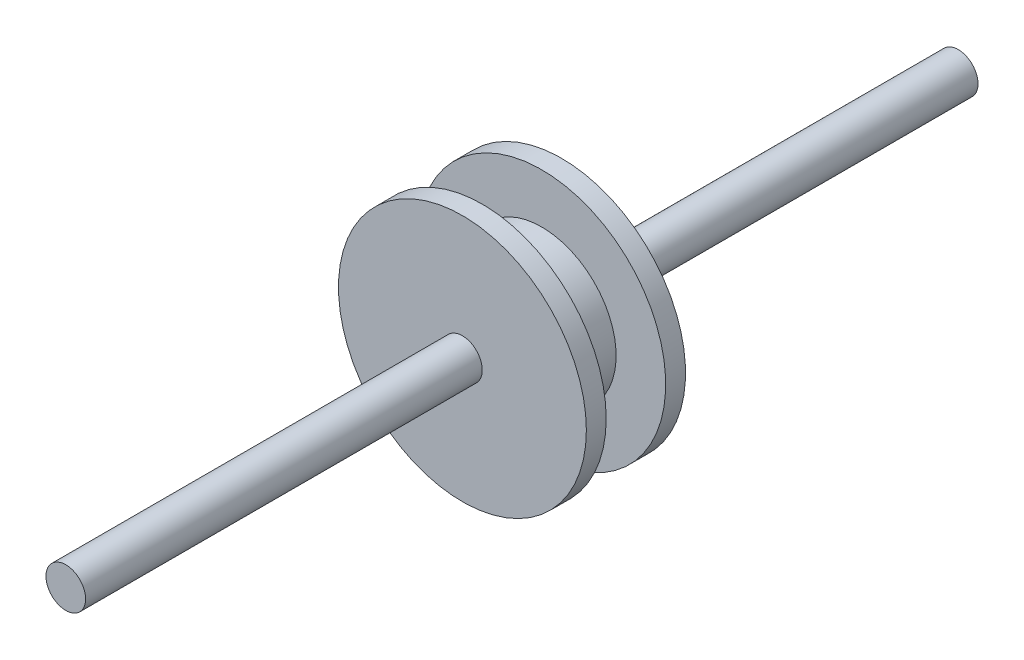
ISO-10303-21;
HEADER;
FILE_DESCRIPTION(('STEP AP214'),'2;1');
FILE_NAME('part.step','',(''),(''),'','','');
FILE_SCHEMA(('AUTOMOTIVE_DESIGN { 1 0 10303 214 1 1 1 1 }'));
ENDSEC;
DATA;
#1=APPLICATION_CONTEXT('core data for automotive mechanical design processes');
#2=APPLICATION_PROTOCOL_DEFINITION('international standard','automotive_design',2000,#1);
#3=PRODUCT_CONTEXT('',#1,'mechanical');
#4=PRODUCT('Part','Part','',(#3));
#5=PRODUCT_RELATED_PRODUCT_CATEGORY('part','',(#4));
#6=PRODUCT_DEFINITION_FORMATION('','',#4);
#7=PRODUCT_DEFINITION_CONTEXT('part definition',#1,'design');
#8=PRODUCT_DEFINITION('design','',#6,#7);
#9=PRODUCT_DEFINITION_SHAPE('','',#8);
#10=(LENGTH_UNIT() NAMED_UNIT(*) SI_UNIT(.MILLI.,.METRE.));
#11=(NAMED_UNIT(*) PLANE_ANGLE_UNIT() SI_UNIT($,.RADIAN.));
#12=(NAMED_UNIT(*) SI_UNIT($,.STERADIAN.) SOLID_ANGLE_UNIT());
#13=UNCERTAINTY_MEASURE_WITH_UNIT(LENGTH_MEASURE(1.E-05),#10,'distance_accuracy_value','');
#14=(GEOMETRIC_REPRESENTATION_CONTEXT(3) GLOBAL_UNCERTAINTY_ASSIGNED_CONTEXT((#13)) GLOBAL_UNIT_ASSIGNED_CONTEXT((#10,
#11,#12)) REPRESENTATION_CONTEXT('',''));
#15=CARTESIAN_POINT('',(0.,0.,0.));
#16=DIRECTION('',(0.,0.,1.));
#17=DIRECTION('',(1.,0.,0.));
#18=AXIS2_PLACEMENT_3D('',#15,#16,#17);
#19=CARTESIAN_POINT('',(0.,0.,10.));
#20=DIRECTION('',(0.,0.,-1.));
#21=DIRECTION('',(-1.,0.,0.));
#22=AXIS2_PLACEMENT_3D('',#19,#20,#21);
#23=CYLINDRICAL_SURFACE('',#22,7.5);
#24=CARTESIAN_POINT('',(0.,0.,2.));
#25=DIRECTION('',(0.,0.,-1.));
#26=DIRECTION('',(-1.,0.,0.));
#27=AXIS2_PLACEMENT_3D('',#24,#25,#26);
#28=CIRCLE('',#27,7.5);
#29=CARTESIAN_POINT('',(-7.5,0.,2.));
#30=VERTEX_POINT('',#29);
#31=EDGE_CURVE('E60',#30,#30,#28,.T.);
#32=ORIENTED_EDGE('',*,*,#31,.F.);
#33=EDGE_LOOP('',(#32));
#34=FACE_BOUND('',#33,.T.);
#35=CARTESIAN_POINT('',(0.,0.,8.));
#36=DIRECTION('',(0.,0.,1.));
#37=DIRECTION('',(1.,0.,0.));
#38=AXIS2_PLACEMENT_3D('',#35,#36,#37);
#39=CIRCLE('',#38,7.5);
#40=CARTESIAN_POINT('',(7.5,0.,8.));
#41=VERTEX_POINT('',#40);
#42=EDGE_CURVE('E34',#41,#41,#39,.T.);
#43=ORIENTED_EDGE('',*,*,#42,.F.);
#44=EDGE_LOOP('',(#43));
#45=FACE_BOUND('',#44,.T.);
#46=ADVANCED_FACE('F31',(#34,#45),#23,.T.);
#47=CARTESIAN_POINT('',(0.,0.,2.));
#48=DIRECTION('',(0.,0.,-1.));
#49=DIRECTION('',(-1.,0.,0.));
#50=AXIS2_PLACEMENT_3D('',#47,#48,#49);
#51=CYLINDRICAL_SURFACE('',#50,12.5);
#52=CARTESIAN_POINT('',(0.,0.,2.));
#53=DIRECTION('',(0.,0.,-1.));
#54=DIRECTION('',(-1.,0.,0.));
#55=AXIS2_PLACEMENT_3D('',#52,#53,#54);
#56=CIRCLE('',#55,12.5);
#57=CARTESIAN_POINT('',(-12.5,0.,2.));
#58=VERTEX_POINT('',#57);
#59=EDGE_CURVE('E57',#58,#58,#56,.T.);
#60=ORIENTED_EDGE('',*,*,#59,.T.);
#61=EDGE_LOOP('',(#60));
#62=FACE_BOUND('',#61,.T.);
#63=CARTESIAN_POINT('',(0.,0.,0.));
#64=DIRECTION('',(0.,0.,-1.));
#65=DIRECTION('',(-1.,0.,0.));
#66=AXIS2_PLACEMENT_3D('',#63,#64,#65);
#67=CIRCLE('',#66,12.5);
#68=CARTESIAN_POINT('',(-12.5,0.,0.));
#69=VERTEX_POINT('',#68);
#70=EDGE_CURVE('E54',#69,#69,#67,.T.);
#71=ORIENTED_EDGE('',*,*,#70,.F.);
#72=EDGE_LOOP('',(#71));
#73=FACE_BOUND('',#72,.T.);
#74=ADVANCED_FACE('F72',(#62,#73),#51,.T.);
#75=CARTESIAN_POINT('',(0.,0.,2.));
#76=DIRECTION('',(0.,0.,-1.));
#77=DIRECTION('',(-1.,0.,0.));
#78=AXIS2_PLACEMENT_3D('',#75,#76,#77);
#79=PLANE('',#78);
#80=ORIENTED_EDGE('',*,*,#31,.T.);
#81=EDGE_LOOP('',(#80));
#82=FACE_BOUND('',#81,.T.);
#83=ORIENTED_EDGE('',*,*,#59,.F.);
#84=EDGE_LOOP('',(#83));
#85=FACE_BOUND('',#84,.T.);
#86=ADVANCED_FACE('F77',(#82,#85),#79,.F.);
#87=CARTESIAN_POINT('',(0.,0.,0.));
#88=DIRECTION('',(0.,0.,1.));
#89=DIRECTION('',(1.,0.,0.));
#90=AXIS2_PLACEMENT_3D('',#87,#88,#89);
#91=PLANE('',#90);
#92=CARTESIAN_POINT('',(0.,0.,0.));
#93=DIRECTION('',(0.,0.,-1.));
#94=DIRECTION('',(-1.,0.,0.));
#95=AXIS2_PLACEMENT_3D('',#92,#93,#94);
#96=CIRCLE('',#95,2.);
#97=CARTESIAN_POINT('',(-2.,0.,0.));
#98=VERTEX_POINT('',#97);
#99=EDGE_CURVE('E10',#98,#98,#96,.T.);
#100=ORIENTED_EDGE('',*,*,#99,.F.);
#101=EDGE_LOOP('',(#100));
#102=FACE_BOUND('',#101,.T.);
#103=ORIENTED_EDGE('',*,*,#70,.T.);
#104=EDGE_LOOP('',(#103));
#105=FACE_BOUND('',#104,.T.);
#106=ADVANCED_FACE('F83',(#102,#105),#91,.F.);
#107=CARTESIAN_POINT('',(0.,0.,8.));
#108=DIRECTION('',(0.,0.,1.));
#109=DIRECTION('',(1.,0.,0.));
#110=AXIS2_PLACEMENT_3D('',#107,#108,#109);
#111=CYLINDRICAL_SURFACE('',#110,12.5);
#112=CARTESIAN_POINT('',(0.,0.,8.));
#113=DIRECTION('',(0.,0.,1.));
#114=DIRECTION('',(1.,0.,0.));
#115=AXIS2_PLACEMENT_3D('',#112,#113,#114);
#116=CIRCLE('',#115,12.5);
#117=CARTESIAN_POINT('',(12.5,0.,8.));
#118=VERTEX_POINT('',#117);
#119=EDGE_CURVE('E51',#118,#118,#116,.T.);
#120=ORIENTED_EDGE('',*,*,#119,.T.);
#121=EDGE_LOOP('',(#120));
#122=FACE_BOUND('',#121,.T.);
#123=CARTESIAN_POINT('',(0.,0.,10.));
#124=DIRECTION('',(0.,0.,1.));
#125=DIRECTION('',(1.,0.,0.));
#126=AXIS2_PLACEMENT_3D('',#123,#124,#125);
#127=CIRCLE('',#126,12.5);
#128=CARTESIAN_POINT('',(12.5,0.,10.));
#129=VERTEX_POINT('',#128);
#130=EDGE_CURVE('E49',#129,#129,#127,.T.);
#131=ORIENTED_EDGE('',*,*,#130,.F.);
#132=EDGE_LOOP('',(#131));
#133=FACE_BOUND('',#132,.T.);
#134=ADVANCED_FACE('F93',(#122,#133),#111,.T.);
#135=CARTESIAN_POINT('',(0.,0.,8.));
#136=DIRECTION('',(0.,0.,1.));
#137=DIRECTION('',(1.,0.,0.));
#138=AXIS2_PLACEMENT_3D('',#135,#136,#137);
#139=PLANE('',#138);
#140=ORIENTED_EDGE('',*,*,#42,.T.);
#141=EDGE_LOOP('',(#140));
#142=FACE_BOUND('',#141,.T.);
#143=ORIENTED_EDGE('',*,*,#119,.F.);
#144=EDGE_LOOP('',(#143));
#145=FACE_BOUND('',#144,.T.);
#146=ADVANCED_FACE('F68',(#142,#145),#139,.F.);
#147=CARTESIAN_POINT('',(0.,0.,10.));
#148=DIRECTION('',(0.,0.,1.));
#149=DIRECTION('',(1.,0.,0.));
#150=AXIS2_PLACEMENT_3D('',#147,#148,#149);
#151=PLANE('',#150);
#152=CARTESIAN_POINT('',(0.,0.,10.));
#153=DIRECTION('',(0.,0.,1.));
#154=DIRECTION('',(1.,0.,0.));
#155=AXIS2_PLACEMENT_3D('',#152,#153,#154);
#156=CIRCLE('',#155,2.);
#157=CARTESIAN_POINT('',(2.,0.,10.));
#158=VERTEX_POINT('',#157);
#159=EDGE_CURVE('E38',#158,#158,#156,.T.);
#160=ORIENTED_EDGE('',*,*,#159,.F.);
#161=EDGE_LOOP('',(#160));
#162=FACE_BOUND('',#161,.T.);
#163=ORIENTED_EDGE('',*,*,#130,.T.);
#164=EDGE_LOOP('',(#163));
#165=FACE_BOUND('',#164,.T.);
#166=ADVANCED_FACE('F88',(#162,#165),#151,.T.);
#167=CARTESIAN_POINT('',(0.,0.,50.));
#168=DIRECTION('',(0.,0.,-1.));
#169=DIRECTION('',(-1.,0.,0.));
#170=AXIS2_PLACEMENT_3D('',#167,#168,#169);
#171=CYLINDRICAL_SURFACE('',#170,2.);
#172=CARTESIAN_POINT('',(0.,0.,50.));
#173=DIRECTION('',(0.,0.,1.));
#174=DIRECTION('',(1.,0.,0.));
#175=AXIS2_PLACEMENT_3D('',#172,#173,#174);
#176=CIRCLE('',#175,2.);
#177=CARTESIAN_POINT('',(2.,0.,50.));
#178=VERTEX_POINT('',#177);
#179=EDGE_CURVE('E47',#178,#178,#176,.T.);
#180=ORIENTED_EDGE('',*,*,#179,.F.);
#181=EDGE_LOOP('',(#180));
#182=FACE_BOUND('',#181,.T.);
#183=ORIENTED_EDGE('',*,*,#159,.T.);
#184=EDGE_LOOP('',(#183));
#185=FACE_BOUND('',#184,.T.);
#186=ADVANCED_FACE('F90',(#182,#185),#171,.T.);
#187=CARTESIAN_POINT('',(0.,0.,50.));
#188=DIRECTION('',(0.,0.,1.));
#189=DIRECTION('',(1.,0.,0.));
#190=AXIS2_PLACEMENT_3D('',#187,#188,#189);
#191=PLANE('',#190);
#192=ORIENTED_EDGE('',*,*,#179,.T.);
#193=EDGE_LOOP('',(#192));
#194=FACE_BOUND('',#193,.T.);
#195=ADVANCED_FACE('F109',(#194),#191,.T.);
#196=CARTESIAN_POINT('',(0.,0.,-40.));
#197=DIRECTION('',(0.,0.,1.));
#198=DIRECTION('',(1.,0.,0.));
#199=AXIS2_PLACEMENT_3D('',#196,#197,#198);
#200=CYLINDRICAL_SURFACE('',#199,2.);
#201=CARTESIAN_POINT('',(0.,0.,-40.));
#202=DIRECTION('',(0.,0.,-1.));
#203=DIRECTION('',(-1.,0.,0.));
#204=AXIS2_PLACEMENT_3D('',#201,#202,#203);
#205=CIRCLE('',#204,2.);
#206=CARTESIAN_POINT('',(-2.,0.,-40.));
#207=VERTEX_POINT('',#206);
#208=EDGE_CURVE('E46',#207,#207,#205,.T.);
#209=ORIENTED_EDGE('',*,*,#208,.F.);
#210=EDGE_LOOP('',(#209));
#211=FACE_BOUND('',#210,.T.);
#212=ORIENTED_EDGE('',*,*,#99,.T.);
#213=EDGE_LOOP('',(#212));
#214=FACE_BOUND('',#213,.T.);
#215=ADVANCED_FACE('F113',(#211,#214),#200,.T.);
#216=CARTESIAN_POINT('',(0.,0.,-40.));
#217=DIRECTION('',(0.,0.,-1.));
#218=DIRECTION('',(-1.,0.,0.));
#219=AXIS2_PLACEMENT_3D('',#216,#217,#218);
#220=PLANE('',#219);
#221=ORIENTED_EDGE('',*,*,#208,.T.);
#222=EDGE_LOOP('',(#221));
#223=FACE_BOUND('',#222,.T.);
#224=ADVANCED_FACE('F117',(#223),#220,.T.);
#225=CLOSED_SHELL('',(#46,#74,#86,#106,#134,#146,#166,#186,#195,#215,#224));
#226=MANIFOLD_SOLID_BREP('B2',#225);
#227=ADVANCED_BREP_SHAPE_REPRESENTATION('',(#18,#226),#14);
#228=SHAPE_DEFINITION_REPRESENTATION(#9,#227);
ENDSEC;
END-ISO-10303-21;
